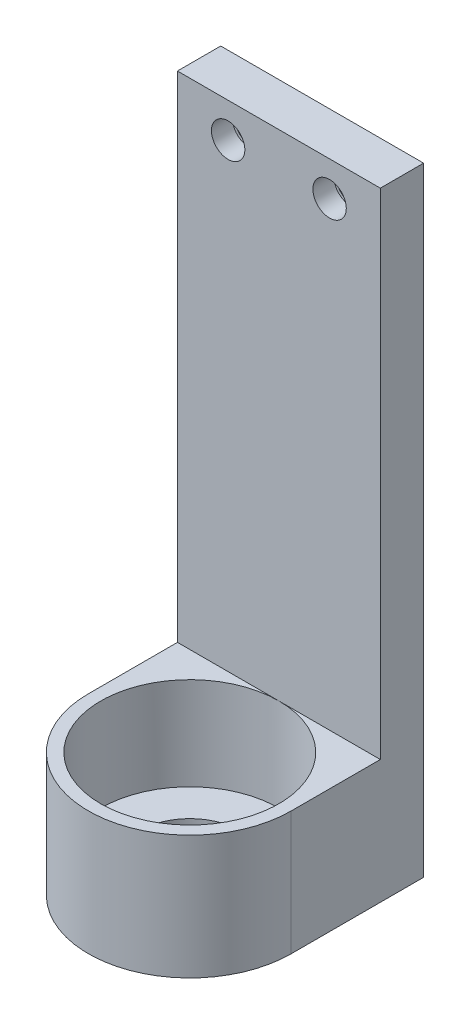
ISO-10303-21;
HEADER;
FILE_DESCRIPTION(('STEP AP214'),'2;1');
FILE_NAME('part.step','',(''),(''),'','','');
FILE_SCHEMA(('AUTOMOTIVE_DESIGN { 1 0 10303 214 1 1 1 1 }'));
ENDSEC;
DATA;
#1=APPLICATION_CONTEXT('core data for automotive mechanical design processes');
#2=APPLICATION_PROTOCOL_DEFINITION('international standard','automotive_design',2000,#1);
#3=PRODUCT_CONTEXT('',#1,'mechanical');
#4=PRODUCT('Part','Part','',(#3));
#5=PRODUCT_RELATED_PRODUCT_CATEGORY('part','',(#4));
#6=PRODUCT_DEFINITION_FORMATION('','',#4);
#7=PRODUCT_DEFINITION_CONTEXT('part definition',#1,'design');
#8=PRODUCT_DEFINITION('design','',#6,#7);
#9=PRODUCT_DEFINITION_SHAPE('','',#8);
#10=(LENGTH_UNIT() NAMED_UNIT(*) SI_UNIT(.MILLI.,.METRE.));
#11=(NAMED_UNIT(*) PLANE_ANGLE_UNIT() SI_UNIT($,.RADIAN.));
#12=(NAMED_UNIT(*) SI_UNIT($,.STERADIAN.) SOLID_ANGLE_UNIT());
#13=UNCERTAINTY_MEASURE_WITH_UNIT(LENGTH_MEASURE(1.E-05),#10,'distance_accuracy_value','');
#14=(GEOMETRIC_REPRESENTATION_CONTEXT(3) GLOBAL_UNCERTAINTY_ASSIGNED_CONTEXT((#13)) GLOBAL_UNIT_ASSIGNED_CONTEXT((#10,
#11,#12)) REPRESENTATION_CONTEXT('',''));
#15=CARTESIAN_POINT('',(0.,0.,0.));
#16=DIRECTION('',(0.,0.,1.));
#17=DIRECTION('',(1.,0.,0.));
#18=AXIS2_PLACEMENT_3D('',#15,#16,#17);
#19=CARTESIAN_POINT('',(0.,100.,0.));
#20=DIRECTION('',(0.,-1.,0.));
#21=DIRECTION('',(0.,0.,-1.));
#22=AXIS2_PLACEMENT_3D('',#19,#20,#21);
#23=CYLINDRICAL_SURFACE('',#22,8.1);
#24=CARTESIAN_POINT('',(0.,0.,0.));
#25=DIRECTION('',(0.,1.,0.));
#26=DIRECTION('',(0.,0.,1.));
#27=AXIS2_PLACEMENT_3D('',#24,#25,#26);
#28=CIRCLE('',#27,8.1);
#29=CARTESIAN_POINT('',(0.,0.,8.1));
#30=VERTEX_POINT('',#29);
#31=EDGE_CURVE('E144',#30,#30,#28,.T.);
#32=ORIENTED_EDGE('',*,*,#31,.F.);
#33=EDGE_LOOP('',(#32));
#34=FACE_BOUND('',#33,.T.);
#35=CARTESIAN_POINT('',(0.,5.,0.));
#36=DIRECTION('',(0.,1.,0.));
#37=DIRECTION('',(0.,0.,1.));
#38=AXIS2_PLACEMENT_3D('',#35,#36,#37);
#39=CIRCLE('',#38,8.1);
#40=CARTESIAN_POINT('',(0.,5.,8.1));
#41=VERTEX_POINT('',#40);
#42=EDGE_CURVE('E43',#41,#41,#39,.T.);
#43=ORIENTED_EDGE('',*,*,#42,.T.);
#44=EDGE_LOOP('',(#43));
#45=FACE_BOUND('',#44,.T.);
#46=ADVANCED_FACE('F39',(#34,#45),#23,.F.);
#47=CARTESIAN_POINT('',(16.4,100.,0.));
#48=DIRECTION('',(-1.,0.,0.));
#49=DIRECTION('',(0.,0.,1.));
#50=AXIS2_PLACEMENT_3D('',#47,#48,#49);
#51=PLANE('',#50);
#52=DIRECTION('',(0.,0.,-1.));
#53=VECTOR('',#52,1.);
#54=CARTESIAN_POINT('',(16.4,20.,0.));
#55=LINE('',#54,#53);
#56=CARTESIAN_POINT('',(16.4,20.,0.));
#57=VERTEX_POINT('',#56);
#58=CARTESIAN_POINT('',(16.4,20.,-14.4));
#59=VERTEX_POINT('',#58);
#60=EDGE_CURVE('E108',#57,#59,#55,.T.);
#61=ORIENTED_EDGE('',*,*,#60,.F.);
#62=DIRECTION('',(0.,-1.,0.));
#63=VECTOR('',#62,1.);
#64=CARTESIAN_POINT('',(16.4,100.,0.));
#65=LINE('',#64,#63);
#66=CARTESIAN_POINT('',(16.4,0.,0.));
#67=VERTEX_POINT('',#66);
#68=EDGE_CURVE('E11',#57,#67,#65,.T.);
#69=ORIENTED_EDGE('',*,*,#68,.T.);
#70=DIRECTION('',(0.,0.,-1.));
#71=VECTOR('',#70,1.);
#72=CARTESIAN_POINT('',(16.4,0.,0.));
#73=LINE('',#72,#71);
#74=CARTESIAN_POINT('',(16.4,0.,-21.4));
#75=VERTEX_POINT('',#74);
#76=EDGE_CURVE('E139',#67,#75,#73,.T.);
#77=ORIENTED_EDGE('',*,*,#76,.T.);
#78=DIRECTION('',(0.,-1.,0.));
#79=VECTOR('',#78,1.);
#80=CARTESIAN_POINT('',(16.4,100.,-21.4));
#81=LINE('',#80,#79);
#82=CARTESIAN_POINT('',(16.4,100.,-21.4));
#83=VERTEX_POINT('',#82);
#84=EDGE_CURVE('E48',#83,#75,#81,.T.);
#85=ORIENTED_EDGE('',*,*,#84,.F.);
#86=DIRECTION('',(0.,0.,-1.));
#87=VECTOR('',#86,1.);
#88=CARTESIAN_POINT('',(16.4,100.,0.));
#89=LINE('',#88,#87);
#90=CARTESIAN_POINT('',(16.4,100.,-14.4));
#91=VERTEX_POINT('',#90);
#92=EDGE_CURVE('E143',#91,#83,#89,.T.);
#93=ORIENTED_EDGE('',*,*,#92,.F.);
#94=DIRECTION('',(0.,1.,0.));
#95=VECTOR('',#94,1.);
#96=CARTESIAN_POINT('',(16.4,20.,-14.4));
#97=LINE('',#96,#95);
#98=EDGE_CURVE('E151',#59,#91,#97,.T.);
#99=ORIENTED_EDGE('',*,*,#98,.F.);
#100=EDGE_LOOP('',(#61,#69,#77,#85,#93,#99));
#101=FACE_BOUND('',#100,.T.);
#102=ADVANCED_FACE('F205',(#101),#51,.F.);
#103=CARTESIAN_POINT('',(0.,100.,0.));
#104=DIRECTION('',(0.,-1.,0.));
#105=DIRECTION('',(0.,0.,-1.));
#106=AXIS2_PLACEMENT_3D('',#103,#104,#105);
#107=CYLINDRICAL_SURFACE('',#106,16.4);
#108=CARTESIAN_POINT('',(0.,20.,0.));
#109=DIRECTION('',(0.,1.,0.));
#110=DIRECTION('',(0.,0.,1.));
#111=AXIS2_PLACEMENT_3D('',#108,#109,#110);
#112=CIRCLE('',#111,16.4);
#113=CARTESIAN_POINT('',(-16.4,20.,0.));
#114=VERTEX_POINT('',#113);
#115=EDGE_CURVE('E100',#114,#57,#112,.T.);
#116=ORIENTED_EDGE('',*,*,#115,.F.);
#117=DIRECTION('',(0.,-1.,0.));
#118=VECTOR('',#117,1.);
#119=CARTESIAN_POINT('',(-16.4,100.,0.));
#120=LINE('',#119,#118);
#121=CARTESIAN_POINT('',(-16.4,0.,0.));
#122=VERTEX_POINT('',#121);
#123=EDGE_CURVE('E110',#114,#122,#120,.T.);
#124=ORIENTED_EDGE('',*,*,#123,.T.);
#125=CARTESIAN_POINT('',(0.,0.,0.));
#126=DIRECTION('',(0.,1.,0.));
#127=DIRECTION('',(0.,0.,1.));
#128=AXIS2_PLACEMENT_3D('',#125,#126,#127);
#129=CIRCLE('',#128,16.4);
#130=EDGE_CURVE('E142',#122,#67,#129,.T.);
#131=ORIENTED_EDGE('',*,*,#130,.T.);
#132=ORIENTED_EDGE('',*,*,#68,.F.);
#133=EDGE_LOOP('',(#116,#124,#131,#132));
#134=FACE_BOUND('',#133,.T.);
#135=ADVANCED_FACE('F41',(#134),#107,.T.);
#136=CARTESIAN_POINT('',(0.,100.,0.));
#137=DIRECTION('',(0.,1.,0.));
#138=DIRECTION('',(0.,0.,1.));
#139=AXIS2_PLACEMENT_3D('',#136,#137,#138);
#140=PLANE('',#139);
#141=DIRECTION('',(-1.,0.,0.));
#142=VECTOR('',#141,1.);
#143=CARTESIAN_POINT('',(-16.4,100.,-14.4));
#144=LINE('',#143,#142);
#145=CARTESIAN_POINT('',(-16.4,100.,-14.4));
#146=VERTEX_POINT('',#145);
#147=EDGE_CURVE('E154',#91,#146,#144,.T.);
#148=ORIENTED_EDGE('',*,*,#147,.F.);
#149=ORIENTED_EDGE('',*,*,#92,.T.);
#150=DIRECTION('',(-1.,0.,0.));
#151=VECTOR('',#150,1.);
#152=CARTESIAN_POINT('',(-16.4,100.,-21.4));
#153=LINE('',#152,#151);
#154=CARTESIAN_POINT('',(-16.4,100.,-21.4));
#155=VERTEX_POINT('',#154);
#156=EDGE_CURVE('E121',#83,#155,#153,.T.);
#157=ORIENTED_EDGE('',*,*,#156,.T.);
#158=DIRECTION('',(0.,0.,1.));
#159=VECTOR('',#158,1.);
#160=CARTESIAN_POINT('',(-16.4,100.,0.));
#161=LINE('',#160,#159);
#162=EDGE_CURVE('E120',#155,#146,#161,.T.);
#163=ORIENTED_EDGE('',*,*,#162,.T.);
#164=EDGE_LOOP('',(#148,#149,#157,#163));
#165=FACE_BOUND('',#164,.T.);
#166=ADVANCED_FACE('F203',(#165),#140,.T.);
#167=CARTESIAN_POINT('',(0.,0.,0.));
#168=DIRECTION('',(0.,1.,0.));
#169=DIRECTION('',(0.,0.,1.));
#170=AXIS2_PLACEMENT_3D('',#167,#168,#169);
#171=PLANE('',#170);
#172=ORIENTED_EDGE('',*,*,#130,.F.);
#173=DIRECTION('',(0.,0.,1.));
#174=VECTOR('',#173,1.);
#175=CARTESIAN_POINT('',(-16.4,0.,0.));
#176=LINE('',#175,#174);
#177=CARTESIAN_POINT('',(-16.4,0.,-21.4));
#178=VERTEX_POINT('',#177);
#179=EDGE_CURVE('E111',#178,#122,#176,.T.);
#180=ORIENTED_EDGE('',*,*,#179,.F.);
#181=DIRECTION('',(-1.,0.,0.));
#182=VECTOR('',#181,1.);
#183=CARTESIAN_POINT('',(-16.4,0.,-21.4));
#184=LINE('',#183,#182);
#185=EDGE_CURVE('E131',#75,#178,#184,.T.);
#186=ORIENTED_EDGE('',*,*,#185,.F.);
#187=ORIENTED_EDGE('',*,*,#76,.F.);
#188=EDGE_LOOP('',(#172,#180,#186,#187));
#189=FACE_BOUND('',#188,.T.);
#190=ORIENTED_EDGE('',*,*,#31,.T.);
#191=EDGE_LOOP('',(#190));
#192=FACE_BOUND('',#191,.T.);
#193=ADVANCED_FACE('F137',(#189,#192),#171,.F.);
#194=CARTESIAN_POINT('',(-16.4,100.,-21.4));
#195=DIRECTION('',(0.,0.,1.));
#196=DIRECTION('',(1.,0.,0.));
#197=AXIS2_PLACEMENT_3D('',#194,#195,#196);
#198=PLANE('',#197);
#199=CARTESIAN_POINT('',(-8.2,94.4109116526564,-21.4));
#200=DIRECTION('',(0.,0.,1.));
#201=DIRECTION('',(1.,0.,0.));
#202=AXIS2_PLACEMENT_3D('',#199,#200,#201);
#203=CIRCLE('',#202,2.25);
#204=CARTESIAN_POINT('',(-5.95,94.4109116526564,-21.4));
#205=VERTEX_POINT('',#204);
#206=EDGE_CURVE('E172',#205,#205,#203,.T.);
#207=ORIENTED_EDGE('',*,*,#206,.T.);
#208=EDGE_LOOP('',(#207));
#209=FACE_BOUND('',#208,.T.);
#210=CARTESIAN_POINT('',(8.2,94.4109116526564,-21.4));
#211=DIRECTION('',(0.,0.,1.));
#212=DIRECTION('',(1.,0.,0.));
#213=AXIS2_PLACEMENT_3D('',#210,#211,#212);
#214=CIRCLE('',#213,2.25);
#215=CARTESIAN_POINT('',(10.45,94.4109116526564,-21.4));
#216=VERTEX_POINT('',#215);
#217=EDGE_CURVE('E161',#216,#216,#214,.T.);
#218=ORIENTED_EDGE('',*,*,#217,.T.);
#219=EDGE_LOOP('',(#218));
#220=FACE_BOUND('',#219,.T.);
#221=ORIENTED_EDGE('',*,*,#185,.T.);
#222=DIRECTION('',(0.,-1.,0.));
#223=VECTOR('',#222,1.);
#224=CARTESIAN_POINT('',(-16.4,100.,-21.4));
#225=LINE('',#224,#223);
#226=EDGE_CURVE('E118',#155,#178,#225,.T.);
#227=ORIENTED_EDGE('',*,*,#226,.F.);
#228=ORIENTED_EDGE('',*,*,#156,.F.);
#229=ORIENTED_EDGE('',*,*,#84,.T.);
#230=EDGE_LOOP('',(#221,#227,#228,#229));
#231=FACE_BOUND('',#230,.T.);
#232=ADVANCED_FACE('F133',(#209,#220,#231),#198,.F.);
#233=CARTESIAN_POINT('',(-16.4,100.,0.));
#234=DIRECTION('',(1.,0.,0.));
#235=DIRECTION('',(0.,0.,-1.));
#236=AXIS2_PLACEMENT_3D('',#233,#234,#235);
#237=PLANE('',#236);
#238=DIRECTION('',(0.,0.,1.));
#239=VECTOR('',#238,1.);
#240=CARTESIAN_POINT('',(-16.4,20.,0.));
#241=LINE('',#240,#239);
#242=CARTESIAN_POINT('',(-16.4,20.,-14.4));
#243=VERTEX_POINT('',#242);
#244=EDGE_CURVE('E95',#243,#114,#241,.T.);
#245=ORIENTED_EDGE('',*,*,#244,.F.);
#246=DIRECTION('',(0.,1.,0.));
#247=VECTOR('',#246,1.);
#248=CARTESIAN_POINT('',(-16.4,20.,-14.4));
#249=LINE('',#248,#247);
#250=EDGE_CURVE('E155',#243,#146,#249,.T.);
#251=ORIENTED_EDGE('',*,*,#250,.T.);
#252=ORIENTED_EDGE('',*,*,#162,.F.);
#253=ORIENTED_EDGE('',*,*,#226,.T.);
#254=ORIENTED_EDGE('',*,*,#179,.T.);
#255=ORIENTED_EDGE('',*,*,#123,.F.);
#256=EDGE_LOOP('',(#245,#251,#252,#253,#254,#255));
#257=FACE_BOUND('',#256,.T.);
#258=ADVANCED_FACE('F112',(#257),#237,.F.);
#259=CARTESIAN_POINT('',(0.,20.,0.));
#260=DIRECTION('',(0.,1.,0.));
#261=DIRECTION('',(0.,0.,1.));
#262=AXIS2_PLACEMENT_3D('',#259,#260,#261);
#263=PLANE('',#262);
#264=DIRECTION('',(-1.,0.,0.));
#265=VECTOR('',#264,1.);
#266=CARTESIAN_POINT('',(-16.4,20.,-14.4));
#267=LINE('',#266,#265);
#268=CARTESIAN_POINT('',(0.,20.,-14.4));
#269=VERTEX_POINT('',#268);
#270=EDGE_CURVE('E105',#59,#269,#267,.T.);
#271=ORIENTED_EDGE('',*,*,#270,.T.);
#272=CARTESIAN_POINT('',(0.,20.,0.));
#273=DIRECTION('',(0.,1.,0.));
#274=DIRECTION('',(0.,0.,1.));
#275=AXIS2_PLACEMENT_3D('',#272,#273,#274);
#276=CIRCLE('',#275,14.4);
#277=EDGE_CURVE('E52',#269,#269,#276,.T.);
#278=ORIENTED_EDGE('',*,*,#277,.F.);
#279=EDGE_CURVE('E56',#269,#243,#267,.T.);
#280=ORIENTED_EDGE('',*,*,#279,.T.);
#281=ORIENTED_EDGE('',*,*,#244,.T.);
#282=ORIENTED_EDGE('',*,*,#115,.T.);
#283=ORIENTED_EDGE('',*,*,#60,.T.);
#284=EDGE_LOOP('',(#271,#278,#280,#281,#282,#283));
#285=FACE_BOUND('',#284,.T.);
#286=ADVANCED_FACE('F92',(#285),#263,.T.);
#287=CARTESIAN_POINT('',(-16.4,20.,-14.4));
#288=DIRECTION('',(0.,0.,-1.));
#289=DIRECTION('',(-1.,0.,0.));
#290=AXIS2_PLACEMENT_3D('',#287,#288,#289);
#291=PLANE('',#290);
#292=CARTESIAN_POINT('',(-8.2,94.4109116526564,-14.4));
#293=DIRECTION('',(0.,0.,1.));
#294=DIRECTION('',(1.,0.,0.));
#295=AXIS2_PLACEMENT_3D('',#292,#293,#294);
#296=CIRCLE('',#295,2.7);
#297=CARTESIAN_POINT('',(-5.5,94.4109116526564,-14.4));
#298=VERTEX_POINT('',#297);
#299=EDGE_CURVE('E184',#298,#298,#296,.T.);
#300=ORIENTED_EDGE('',*,*,#299,.F.);
#301=EDGE_LOOP('',(#300));
#302=FACE_BOUND('',#301,.T.);
#303=CARTESIAN_POINT('',(8.2,94.4109116526564,-14.4));
#304=DIRECTION('',(0.,0.,1.));
#305=DIRECTION('',(1.,0.,0.));
#306=AXIS2_PLACEMENT_3D('',#303,#304,#305);
#307=CIRCLE('',#306,2.7);
#308=CARTESIAN_POINT('',(10.9,94.4109116526564,-14.4));
#309=VERTEX_POINT('',#308);
#310=EDGE_CURVE('E175',#309,#309,#307,.T.);
#311=ORIENTED_EDGE('',*,*,#310,.F.);
#312=EDGE_LOOP('',(#311));
#313=FACE_BOUND('',#312,.T.);
#314=ORIENTED_EDGE('',*,*,#147,.T.);
#315=ORIENTED_EDGE('',*,*,#250,.F.);
#316=ORIENTED_EDGE('',*,*,#279,.F.);
#317=ORIENTED_EDGE('',*,*,#270,.F.);
#318=ORIENTED_EDGE('',*,*,#98,.T.);
#319=EDGE_LOOP('',(#314,#315,#316,#317,#318));
#320=FACE_BOUND('',#319,.T.);
#321=ADVANCED_FACE('F187',(#302,#313,#320),#291,.F.);
#322=CARTESIAN_POINT('',(0.,5.,0.));
#323=DIRECTION('',(0.,1.,0.));
#324=DIRECTION('',(0.,0.,1.));
#325=AXIS2_PLACEMENT_3D('',#322,#323,#324);
#326=CYLINDRICAL_SURFACE('',#325,14.4);
#327=CARTESIAN_POINT('',(0.,5.,0.));
#328=DIRECTION('',(0.,1.,0.));
#329=DIRECTION('',(0.,0.,1.));
#330=AXIS2_PLACEMENT_3D('',#327,#328,#329);
#331=CIRCLE('',#330,14.4);
#332=CARTESIAN_POINT('',(0.,5.,14.4));
#333=VERTEX_POINT('',#332);
#334=EDGE_CURVE('E159',#333,#333,#331,.T.);
#335=ORIENTED_EDGE('',*,*,#334,.F.);
#336=EDGE_LOOP('',(#335));
#337=FACE_BOUND('',#336,.T.);
#338=ORIENTED_EDGE('',*,*,#277,.T.);
#339=EDGE_LOOP('',(#338));
#340=FACE_BOUND('',#339,.T.);
#341=ADVANCED_FACE('F192',(#337,#340),#326,.F.);
#342=CARTESIAN_POINT('',(0.,5.,0.));
#343=DIRECTION('',(0.,1.,0.));
#344=DIRECTION('',(0.,0.,1.));
#345=AXIS2_PLACEMENT_3D('',#342,#343,#344);
#346=PLANE('',#345);
#347=ORIENTED_EDGE('',*,*,#42,.F.);
#348=EDGE_LOOP('',(#347));
#349=FACE_BOUND('',#348,.T.);
#350=ORIENTED_EDGE('',*,*,#334,.T.);
#351=EDGE_LOOP('',(#350));
#352=FACE_BOUND('',#351,.T.);
#353=ADVANCED_FACE('F221',(#349,#352),#346,.T.);
#354=CARTESIAN_POINT('',(8.2,94.4109116526564,-14.4));
#355=DIRECTION('',(0.,0.,1.));
#356=DIRECTION('',(1.,0.,0.));
#357=AXIS2_PLACEMENT_3D('',#354,#355,#356);
#358=CYLINDRICAL_SURFACE('',#357,2.25);
#359=ORIENTED_EDGE('',*,*,#217,.F.);
#360=EDGE_LOOP('',(#359));
#361=FACE_BOUND('',#360,.T.);
#362=CARTESIAN_POINT('',(8.2,94.4109116526564,-17.8));
#363=DIRECTION('',(0.,0.,1.));
#364=DIRECTION('',(1.,0.,0.));
#365=AXIS2_PLACEMENT_3D('',#362,#363,#364);
#366=CIRCLE('',#365,2.25);
#367=CARTESIAN_POINT('',(10.45,94.4109116526564,-17.8));
#368=VERTEX_POINT('',#367);
#369=EDGE_CURVE('E167',#368,#368,#366,.T.);
#370=ORIENTED_EDGE('',*,*,#369,.T.);
#371=EDGE_LOOP('',(#370));
#372=FACE_BOUND('',#371,.T.);
#373=ADVANCED_FACE('F226',(#361,#372),#358,.F.);
#374=CARTESIAN_POINT('',(10.45,94.4109116526564,-17.8));
#375=DIRECTION('',(0.,0.,-1.));
#376=DIRECTION('',(-1.,0.,0.));
#377=AXIS2_PLACEMENT_3D('',#374,#375,#376);
#378=PLANE('',#377);
#379=ORIENTED_EDGE('',*,*,#369,.F.);
#380=EDGE_LOOP('',(#379));
#381=FACE_BOUND('',#380,.T.);
#382=CARTESIAN_POINT('',(8.2,94.4109116526564,-17.8));
#383=DIRECTION('',(0.,0.,1.));
#384=DIRECTION('',(1.,0.,0.));
#385=AXIS2_PLACEMENT_3D('',#382,#383,#384);
#386=CIRCLE('',#385,2.7);
#387=CARTESIAN_POINT('',(10.9,94.4109116526564,-17.8));
#388=VERTEX_POINT('',#387);
#389=EDGE_CURVE('E166',#388,#388,#386,.T.);
#390=ORIENTED_EDGE('',*,*,#389,.T.);
#391=EDGE_LOOP('',(#390));
#392=FACE_BOUND('',#391,.T.);
#393=ADVANCED_FACE('F235',(#381,#392),#378,.F.);
#394=CARTESIAN_POINT('',(8.2,94.4109116526564,-14.4));
#395=DIRECTION('',(0.,0.,1.));
#396=DIRECTION('',(1.,0.,0.));
#397=AXIS2_PLACEMENT_3D('',#394,#395,#396);
#398=CYLINDRICAL_SURFACE('',#397,2.7);
#399=ORIENTED_EDGE('',*,*,#389,.F.);
#400=EDGE_LOOP('',(#399));
#401=FACE_BOUND('',#400,.T.);
#402=ORIENTED_EDGE('',*,*,#310,.T.);
#403=EDGE_LOOP('',(#402));
#404=FACE_BOUND('',#403,.T.);
#405=ADVANCED_FACE('F237',(#401,#404),#398,.F.);
#406=CARTESIAN_POINT('',(-8.2,94.4109116526564,-14.4));
#407=DIRECTION('',(0.,0.,1.));
#408=DIRECTION('',(1.,0.,0.));
#409=AXIS2_PLACEMENT_3D('',#406,#407,#408);
#410=CYLINDRICAL_SURFACE('',#409,2.25);
#411=ORIENTED_EDGE('',*,*,#206,.F.);
#412=EDGE_LOOP('',(#411));
#413=FACE_BOUND('',#412,.T.);
#414=CARTESIAN_POINT('',(-8.2,94.4109116526564,-17.8));
#415=DIRECTION('',(0.,0.,1.));
#416=DIRECTION('',(1.,0.,0.));
#417=AXIS2_PLACEMENT_3D('',#414,#415,#416);
#418=CIRCLE('',#417,2.25);
#419=CARTESIAN_POINT('',(-5.95,94.4109116526564,-17.8));
#420=VERTEX_POINT('',#419);
#421=EDGE_CURVE('E177',#420,#420,#418,.T.);
#422=ORIENTED_EDGE('',*,*,#421,.T.);
#423=EDGE_LOOP('',(#422));
#424=FACE_BOUND('',#423,.T.);
#425=ADVANCED_FACE('F238',(#413,#424),#410,.F.);
#426=CARTESIAN_POINT('',(-5.95,94.4109116526564,-17.8));
#427=DIRECTION('',(0.,0.,-1.));
#428=DIRECTION('',(-1.,0.,0.));
#429=AXIS2_PLACEMENT_3D('',#426,#427,#428);
#430=PLANE('',#429);
#431=ORIENTED_EDGE('',*,*,#421,.F.);
#432=EDGE_LOOP('',(#431));
#433=FACE_BOUND('',#432,.T.);
#434=CARTESIAN_POINT('',(-8.2,94.4109116526564,-17.8));
#435=DIRECTION('',(0.,0.,1.));
#436=DIRECTION('',(1.,0.,0.));
#437=AXIS2_PLACEMENT_3D('',#434,#435,#436);
#438=CIRCLE('',#437,2.7);
#439=CARTESIAN_POINT('',(-5.5,94.4109116526564,-17.8));
#440=VERTEX_POINT('',#439);
#441=EDGE_CURVE('E182',#440,#440,#438,.T.);
#442=ORIENTED_EDGE('',*,*,#441,.T.);
#443=EDGE_LOOP('',(#442));
#444=FACE_BOUND('',#443,.T.);
#445=ADVANCED_FACE('F244',(#433,#444),#430,.F.);
#446=CARTESIAN_POINT('',(-8.2,94.4109116526564,-14.4));
#447=DIRECTION('',(0.,0.,1.));
#448=DIRECTION('',(1.,0.,0.));
#449=AXIS2_PLACEMENT_3D('',#446,#447,#448);
#450=CYLINDRICAL_SURFACE('',#449,2.7);
#451=ORIENTED_EDGE('',*,*,#441,.F.);
#452=EDGE_LOOP('',(#451));
#453=FACE_BOUND('',#452,.T.);
#454=ORIENTED_EDGE('',*,*,#299,.T.);
#455=EDGE_LOOP('',(#454));
#456=FACE_BOUND('',#455,.T.);
#457=ADVANCED_FACE('F186',(#453,#456),#450,.F.);
#458=CLOSED_SHELL('',(#46,#102,#135,#166,#193,#232,#258,#286,#321,#341,#353,#373,#393,#405,#425,
#445,#457));
#459=MANIFOLD_SOLID_BREP('B2',#458);
#460=ADVANCED_BREP_SHAPE_REPRESENTATION('',(#18,#459),#14);
#461=SHAPE_DEFINITION_REPRESENTATION(#9,#460);
ENDSEC;
END-ISO-10303-21;
